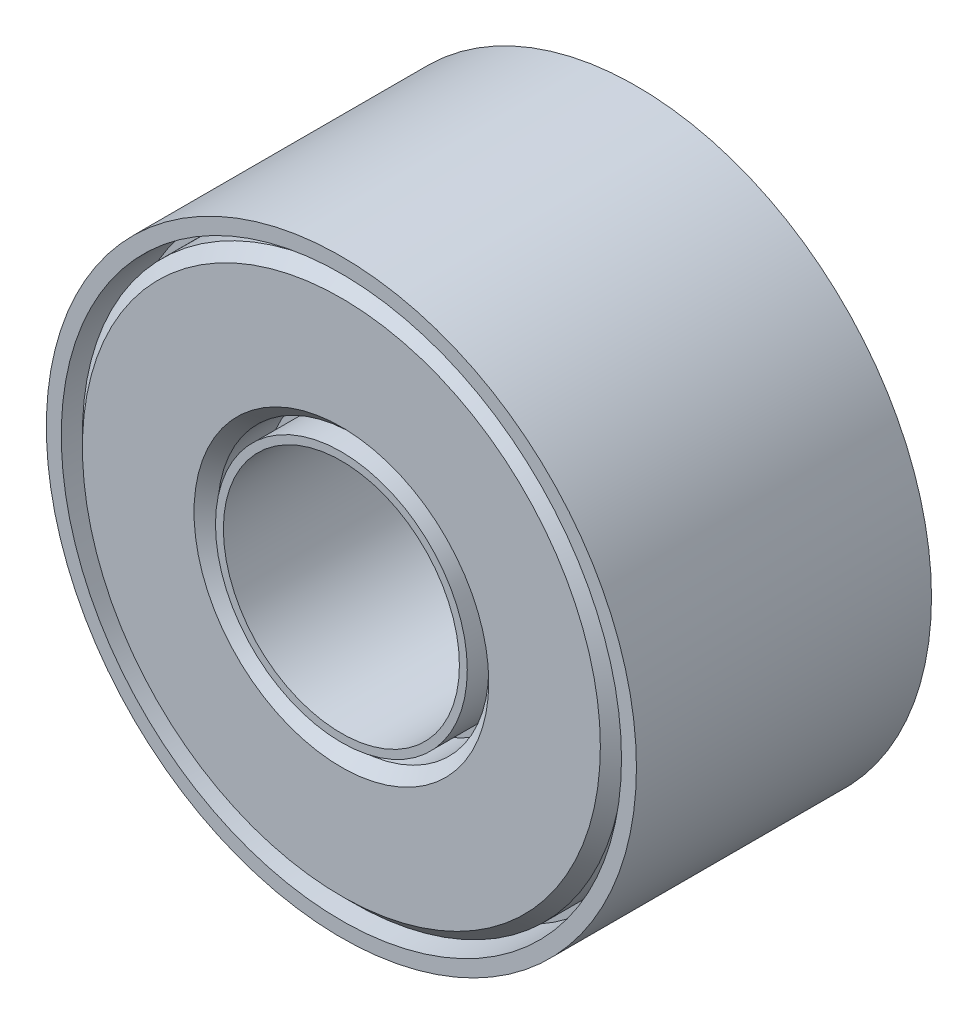
ISO-10303-21;
HEADER;
FILE_DESCRIPTION(('STEP AP214'),'2;1');
FILE_NAME('part.step','',(''),(''),'','','');
FILE_SCHEMA(('AUTOMOTIVE_DESIGN { 1 0 10303 214 1 1 1 1 }'));
ENDSEC;
DATA;
#1=APPLICATION_CONTEXT('core data for automotive mechanical design processes');
#2=APPLICATION_PROTOCOL_DEFINITION('international standard','automotive_design',2000,#1);
#3=PRODUCT_CONTEXT('',#1,'mechanical');
#4=PRODUCT('Part','Part','',(#3));
#5=PRODUCT_RELATED_PRODUCT_CATEGORY('part','',(#4));
#6=PRODUCT_DEFINITION_FORMATION('','',#4);
#7=PRODUCT_DEFINITION_CONTEXT('part definition',#1,'design');
#8=PRODUCT_DEFINITION('design','',#6,#7);
#9=PRODUCT_DEFINITION_SHAPE('','',#8);
#10=(LENGTH_UNIT() NAMED_UNIT(*) SI_UNIT(.MILLI.,.METRE.));
#11=(NAMED_UNIT(*) PLANE_ANGLE_UNIT() SI_UNIT($,.RADIAN.));
#12=(NAMED_UNIT(*) SI_UNIT($,.STERADIAN.) SOLID_ANGLE_UNIT());
#13=UNCERTAINTY_MEASURE_WITH_UNIT(LENGTH_MEASURE(1.E-05),#10,'distance_accuracy_value','');
#14=(GEOMETRIC_REPRESENTATION_CONTEXT(3) GLOBAL_UNCERTAINTY_ASSIGNED_CONTEXT((#13)) GLOBAL_UNIT_ASSIGNED_CONTEXT((#10,
#11,#12)) REPRESENTATION_CONTEXT('',''));
#15=CARTESIAN_POINT('',(0.,0.,0.));
#16=DIRECTION('',(0.,0.,1.));
#17=DIRECTION('',(1.,0.,0.));
#18=AXIS2_PLACEMENT_3D('',#15,#16,#17);
#19=CARTESIAN_POINT('',(0.,0.,0.));
#20=DIRECTION('',(0.,0.,1.));
#21=DIRECTION('',(1.,0.,0.));
#22=AXIS2_PLACEMENT_3D('',#19,#20,#21);
#23=PLANE('',#22);
#24=CARTESIAN_POINT('',(0.,0.,0.));
#25=DIRECTION('',(0.,0.,1.));
#26=DIRECTION('',(1.,0.,0.));
#27=AXIS2_PLACEMENT_3D('',#24,#25,#26);
#28=CIRCLE('',#27,1.);
#29=CARTESIAN_POINT('',(1.,0.,0.));
#30=VERTEX_POINT('',#29);
#31=EDGE_CURVE('E105',#30,#30,#28,.T.);
#32=ORIENTED_EDGE('',*,*,#31,.T.);
#33=EDGE_LOOP('',(#32));
#34=FACE_BOUND('',#33,.T.);
#35=CARTESIAN_POINT('',(0.,0.,0.));
#36=DIRECTION('',(0.,0.,1.));
#37=DIRECTION('',(1.,0.,0.));
#38=AXIS2_PLACEMENT_3D('',#35,#36,#37);
#39=CIRCLE('',#38,1.06669738194311);
#40=CARTESIAN_POINT('',(1.06669738194311,0.,0.));
#41=VERTEX_POINT('',#40);
#42=EDGE_CURVE('E137',#41,#41,#39,.T.);
#43=ORIENTED_EDGE('',*,*,#42,.F.);
#44=EDGE_LOOP('',(#43));
#45=FACE_BOUND('',#44,.T.);
#46=ADVANCED_FACE('F55',(#34,#45),#23,.F.);
#47=CARTESIAN_POINT('',(0.,0.,2.5));
#48=DIRECTION('',(0.,0.,1.));
#49=DIRECTION('',(1.,0.,0.));
#50=AXIS2_PLACEMENT_3D('',#47,#48,#49);
#51=PLANE('',#50);
#52=CARTESIAN_POINT('',(0.,0.,2.5));
#53=DIRECTION('',(0.,0.,1.));
#54=DIRECTION('',(1.,0.,0.));
#55=AXIS2_PLACEMENT_3D('',#52,#53,#54);
#56=CIRCLE('',#55,1.);
#57=CARTESIAN_POINT('',(1.,0.,2.5));
#58=VERTEX_POINT('',#57);
#59=EDGE_CURVE('E101',#58,#58,#56,.T.);
#60=ORIENTED_EDGE('',*,*,#59,.F.);
#61=EDGE_LOOP('',(#60));
#62=FACE_BOUND('',#61,.T.);
#63=CARTESIAN_POINT('',(0.,0.,2.5));
#64=DIRECTION('',(0.,0.,1.));
#65=DIRECTION('',(1.,0.,0.));
#66=AXIS2_PLACEMENT_3D('',#63,#64,#65);
#67=CIRCLE('',#66,1.06669738194311);
#68=CARTESIAN_POINT('',(1.06669738194311,0.,2.5));
#69=VERTEX_POINT('',#68);
#70=EDGE_CURVE('E113',#69,#69,#67,.T.);
#71=ORIENTED_EDGE('',*,*,#70,.T.);
#72=EDGE_LOOP('',(#71));
#73=FACE_BOUND('',#72,.T.);
#74=ADVANCED_FACE('F179',(#62,#73),#51,.T.);
#75=CARTESIAN_POINT('',(0.,0.,2.5));
#76=DIRECTION('',(0.,0.,1.));
#77=DIRECTION('',(1.,0.,0.));
#78=AXIS2_PLACEMENT_3D('',#75,#76,#77);
#79=CIRCLE('',#78,2.37345333101768);
#80=CARTESIAN_POINT('',(2.37345333101768,0.,2.5));
#81=VERTEX_POINT('',#80);
#82=EDGE_CURVE('E125',#81,#81,#79,.T.);
#83=ORIENTED_EDGE('',*,*,#82,.F.);
#84=EDGE_LOOP('',(#83));
#85=FACE_BOUND('',#84,.T.);
#86=CARTESIAN_POINT('',(0.,0.,2.5));
#87=DIRECTION('',(0.,0.,1.));
#88=DIRECTION('',(1.,0.,0.));
#89=AXIS2_PLACEMENT_3D('',#86,#87,#88);
#90=CIRCLE('',#89,2.5);
#91=CARTESIAN_POINT('',(2.5,0.,2.5));
#92=VERTEX_POINT('',#91);
#93=EDGE_CURVE('E96',#92,#92,#90,.T.);
#94=ORIENTED_EDGE('',*,*,#93,.T.);
#95=EDGE_LOOP('',(#94));
#96=FACE_BOUND('',#95,.T.);
#97=ADVANCED_FACE('F187',(#85,#96),#51,.T.);
#98=CARTESIAN_POINT('',(0.,0.,0.));
#99=DIRECTION('',(0.,0.,1.));
#100=DIRECTION('',(1.,0.,0.));
#101=AXIS2_PLACEMENT_3D('',#98,#99,#100);
#102=CIRCLE('',#101,2.37345333101768);
#103=CARTESIAN_POINT('',(2.37345333101768,0.,0.));
#104=VERTEX_POINT('',#103);
#105=EDGE_CURVE('E149',#104,#104,#102,.T.);
#106=ORIENTED_EDGE('',*,*,#105,.T.);
#107=EDGE_LOOP('',(#106));
#108=FACE_BOUND('',#107,.T.);
#109=CARTESIAN_POINT('',(0.,0.,0.));
#110=DIRECTION('',(0.,0.,1.));
#111=DIRECTION('',(1.,0.,0.));
#112=AXIS2_PLACEMENT_3D('',#109,#110,#111);
#113=CIRCLE('',#112,2.5);
#114=CARTESIAN_POINT('',(2.5,0.,0.));
#115=VERTEX_POINT('',#114);
#116=EDGE_CURVE('E97',#115,#115,#113,.T.);
#117=ORIENTED_EDGE('',*,*,#116,.F.);
#118=EDGE_LOOP('',(#117));
#119=FACE_BOUND('',#118,.T.);
#120=ADVANCED_FACE('F182',(#108,#119),#23,.F.);
#121=CARTESIAN_POINT('',(0.,0.,2.5));
#122=DIRECTION('',(0.,0.,-1.));
#123=DIRECTION('',(-1.,0.,0.));
#124=AXIS2_PLACEMENT_3D('',#121,#122,#123);
#125=CYLINDRICAL_SURFACE('',#124,2.5);
#126=ORIENTED_EDGE('',*,*,#93,.F.);
#127=EDGE_LOOP('',(#126));
#128=FACE_BOUND('',#127,.T.);
#129=ORIENTED_EDGE('',*,*,#116,.T.);
#130=EDGE_LOOP('',(#129));
#131=FACE_BOUND('',#130,.T.);
#132=ADVANCED_FACE('F194',(#128,#131),#125,.T.);
#133=CARTESIAN_POINT('',(0.,0.,2.5));
#134=DIRECTION('',(0.,0.,-1.));
#135=DIRECTION('',(-1.,0.,0.));
#136=AXIS2_PLACEMENT_3D('',#133,#134,#135);
#137=CYLINDRICAL_SURFACE('',#136,1.);
#138=ORIENTED_EDGE('',*,*,#59,.T.);
#139=EDGE_LOOP('',(#138));
#140=FACE_BOUND('',#139,.T.);
#141=ORIENTED_EDGE('',*,*,#31,.F.);
#142=EDGE_LOOP('',(#141));
#143=FACE_BOUND('',#142,.T.);
#144=ADVANCED_FACE('F366',(#140,#143),#137,.F.);
#145=CARTESIAN_POINT('',(0.,0.,2.));
#146=DIRECTION('',(0.,0.,1.));
#147=DIRECTION('',(1.,0.,0.));
#148=AXIS2_PLACEMENT_3D('',#145,#146,#147);
#149=CYLINDRICAL_SURFACE('',#148,1.06669738194311);
#150=CARTESIAN_POINT('',(0.,0.,2.));
#151=DIRECTION('',(0.,0.,1.));
#152=DIRECTION('',(1.,0.,0.));
#153=AXIS2_PLACEMENT_3D('',#150,#151,#152);
#154=CIRCLE('',#153,1.06669738194311);
#155=CARTESIAN_POINT('',(1.06669738194311,0.,2.));
#156=VERTEX_POINT('',#155);
#157=EDGE_CURVE('E117',#156,#156,#154,.T.);
#158=ORIENTED_EDGE('',*,*,#157,.T.);
#159=EDGE_LOOP('',(#158));
#160=FACE_BOUND('',#159,.T.);
#161=ORIENTED_EDGE('',*,*,#70,.F.);
#162=EDGE_LOOP('',(#161));
#163=FACE_BOUND('',#162,.T.);
#164=ADVANCED_FACE('F336',(#160,#163),#149,.T.);
#165=CARTESIAN_POINT('',(0.,0.,2.));
#166=DIRECTION('',(0.,0.,1.));
#167=DIRECTION('',(1.,0.,0.));
#168=AXIS2_PLACEMENT_3D('',#165,#166,#167);
#169=CYLINDRICAL_SURFACE('',#168,1.14863392921502);
#170=CARTESIAN_POINT('',(0.,0.,2.4));
#171=DIRECTION('',(0.,0.,1.));
#172=DIRECTION('',(1.,0.,0.));
#173=AXIS2_PLACEMENT_3D('',#170,#171,#172);
#174=CIRCLE('',#173,1.14863392921502);
#175=CARTESIAN_POINT('',(1.14863392921502,0.,2.4));
#176=VERTEX_POINT('',#175);
#177=EDGE_CURVE('E80',#176,#176,#174,.T.);
#178=ORIENTED_EDGE('',*,*,#177,.T.);
#179=EDGE_LOOP('',(#178));
#180=FACE_BOUND('',#179,.T.);
#181=CARTESIAN_POINT('',(0.,0.,2.));
#182=DIRECTION('',(0.,0.,1.));
#183=DIRECTION('',(1.,0.,0.));
#184=AXIS2_PLACEMENT_3D('',#181,#182,#183);
#185=CIRCLE('',#184,1.14863392921502);
#186=CARTESIAN_POINT('',(1.14863392921502,0.,2.));
#187=VERTEX_POINT('',#186);
#188=EDGE_CURVE('E109',#187,#187,#185,.T.);
#189=ORIENTED_EDGE('',*,*,#188,.F.);
#190=EDGE_LOOP('',(#189));
#191=FACE_BOUND('',#190,.T.);
#192=ADVANCED_FACE('F331',(#180,#191),#169,.F.);
#193=CARTESIAN_POINT('',(0.,0.,2.));
#194=DIRECTION('',(0.,0.,1.));
#195=DIRECTION('',(1.,0.,0.));
#196=AXIS2_PLACEMENT_3D('',#193,#194,#195);
#197=PLANE('',#196);
#198=ORIENTED_EDGE('',*,*,#157,.F.);
#199=EDGE_LOOP('',(#198));
#200=FACE_BOUND('',#199,.T.);
#201=ORIENTED_EDGE('',*,*,#188,.T.);
#202=EDGE_LOOP('',(#201));
#203=FACE_BOUND('',#202,.T.);
#204=ADVANCED_FACE('F321',(#200,#203),#197,.T.);
#205=CARTESIAN_POINT('',(0.,0.,2.));
#206=DIRECTION('',(0.,0.,1.));
#207=DIRECTION('',(1.,0.,0.));
#208=AXIS2_PLACEMENT_3D('',#205,#206,#207);
#209=CYLINDRICAL_SURFACE('',#208,2.29427452184268);
#210=CARTESIAN_POINT('',(0.,0.,2.4));
#211=DIRECTION('',(0.,0.,1.));
#212=DIRECTION('',(1.,0.,0.));
#213=AXIS2_PLACEMENT_3D('',#210,#211,#212);
#214=CIRCLE('',#213,2.29427452184268);
#215=CARTESIAN_POINT('',(2.29427452184268,0.,2.4));
#216=VERTEX_POINT('',#215);
#217=EDGE_CURVE('E84',#216,#216,#214,.F.);
#218=ORIENTED_EDGE('',*,*,#217,.T.);
#219=EDGE_LOOP('',(#218));
#220=FACE_BOUND('',#219,.T.);
#221=CARTESIAN_POINT('',(0.,0.,2.));
#222=DIRECTION('',(0.,0.,1.));
#223=DIRECTION('',(1.,0.,0.));
#224=AXIS2_PLACEMENT_3D('',#221,#222,#223);
#225=CIRCLE('',#224,2.29427452184268);
#226=CARTESIAN_POINT('',(2.29427452184268,0.,2.));
#227=VERTEX_POINT('',#226);
#228=EDGE_CURVE('E129',#227,#227,#225,.T.);
#229=ORIENTED_EDGE('',*,*,#228,.T.);
#230=EDGE_LOOP('',(#229));
#231=FACE_BOUND('',#230,.T.);
#232=ADVANCED_FACE('F315',(#220,#231),#209,.T.);
#233=CARTESIAN_POINT('',(0.,0.,2.));
#234=DIRECTION('',(0.,0.,1.));
#235=DIRECTION('',(1.,0.,0.));
#236=AXIS2_PLACEMENT_3D('',#233,#234,#235);
#237=CYLINDRICAL_SURFACE('',#236,2.37345333101768);
#238=CARTESIAN_POINT('',(0.,0.,2.));
#239=DIRECTION('',(0.,0.,1.));
#240=DIRECTION('',(1.,0.,0.));
#241=AXIS2_PLACEMENT_3D('',#238,#239,#240);
#242=CIRCLE('',#241,2.37345333101768);
#243=CARTESIAN_POINT('',(2.37345333101768,0.,2.));
#244=VERTEX_POINT('',#243);
#245=EDGE_CURVE('E118',#244,#244,#242,.T.);
#246=ORIENTED_EDGE('',*,*,#245,.F.);
#247=EDGE_LOOP('',(#246));
#248=FACE_BOUND('',#247,.T.);
#249=ORIENTED_EDGE('',*,*,#82,.T.);
#250=EDGE_LOOP('',(#249));
#251=FACE_BOUND('',#250,.T.);
#252=ADVANCED_FACE('F320',(#248,#251),#237,.F.);
#253=CARTESIAN_POINT('',(0.,0.,2.));
#254=DIRECTION('',(0.,0.,1.));
#255=DIRECTION('',(1.,0.,0.));
#256=AXIS2_PLACEMENT_3D('',#253,#254,#255);
#257=PLANE('',#256);
#258=ORIENTED_EDGE('',*,*,#228,.F.);
#259=EDGE_LOOP('',(#258));
#260=FACE_BOUND('',#259,.T.);
#261=ORIENTED_EDGE('',*,*,#245,.T.);
#262=EDGE_LOOP('',(#261));
#263=FACE_BOUND('',#262,.T.);
#264=ADVANCED_FACE('F307',(#260,#263),#257,.T.);
#265=CARTESIAN_POINT('',(0.,0.,2.5));
#266=DIRECTION('',(0.,0.,1.));
#267=DIRECTION('',(1.,0.,0.));
#268=AXIS2_PLACEMENT_3D('',#265,#266,#267);
#269=CIRCLE('',#268,2.19427452184268);
#270=CARTESIAN_POINT('',(2.19427452184268,0.,2.5));
#271=VERTEX_POINT('',#270);
#272=EDGE_CURVE('E88',#271,#271,#269,.T.);
#273=ORIENTED_EDGE('',*,*,#272,.T.);
#274=EDGE_LOOP('',(#273));
#275=FACE_BOUND('',#274,.T.);
#276=CARTESIAN_POINT('',(0.,0.,2.5));
#277=DIRECTION('',(0.,0.,1.));
#278=DIRECTION('',(1.,0.,0.));
#279=AXIS2_PLACEMENT_3D('',#276,#277,#278);
#280=CIRCLE('',#279,1.24863392921501);
#281=CARTESIAN_POINT('',(1.24863392921501,0.,2.5));
#282=VERTEX_POINT('',#281);
#283=EDGE_CURVE('E92',#282,#282,#280,.F.);
#284=ORIENTED_EDGE('',*,*,#283,.T.);
#285=EDGE_LOOP('',(#284));
#286=FACE_BOUND('',#285,.T.);
#287=ADVANCED_FACE('F190',(#275,#286),#51,.T.);
#288=CARTESIAN_POINT('',(0.,0.,2.5));
#289=DIRECTION('',(0.,0.,-1.));
#290=DIRECTION('',(-1.,0.,0.));
#291=AXIS2_PLACEMENT_3D('',#288,#289,#290);
#292=CONICAL_SURFACE('',#291,2.19427452184268,0.785398163397448);
#293=ORIENTED_EDGE('',*,*,#217,.F.);
#294=EDGE_LOOP('',(#293));
#295=FACE_BOUND('',#294,.T.);
#296=ORIENTED_EDGE('',*,*,#272,.F.);
#297=EDGE_LOOP('',(#296));
#298=FACE_BOUND('',#297,.T.);
#299=ADVANCED_FACE('F287',(#295,#298),#292,.T.);
#300=CARTESIAN_POINT('',(0.,0.,2.4));
#301=DIRECTION('',(0.,0.,1.));
#302=DIRECTION('',(1.,0.,0.));
#303=AXIS2_PLACEMENT_3D('',#300,#301,#302);
#304=CONICAL_SURFACE('',#303,1.14863392921502,0.785398163397454);
#305=ORIENTED_EDGE('',*,*,#283,.F.);
#306=EDGE_LOOP('',(#305));
#307=FACE_BOUND('',#306,.T.);
#308=ORIENTED_EDGE('',*,*,#177,.F.);
#309=EDGE_LOOP('',(#308));
#310=FACE_BOUND('',#309,.T.);
#311=ADVANCED_FACE('F262',(#307,#310),#304,.F.);
#312=CARTESIAN_POINT('',(0.,0.,0.5));
#313=DIRECTION('',(0.,0.,-1.));
#314=DIRECTION('',(-1.,0.,0.));
#315=AXIS2_PLACEMENT_3D('',#312,#313,#314);
#316=CYLINDRICAL_SURFACE('',#315,1.06669738194311);
#317=CARTESIAN_POINT('',(0.,0.,0.5));
#318=DIRECTION('',(0.,0.,1.));
#319=DIRECTION('',(1.,0.,0.));
#320=AXIS2_PLACEMENT_3D('',#317,#318,#319);
#321=CIRCLE('',#320,1.06669738194311);
#322=CARTESIAN_POINT('',(1.06669738194311,0.,0.5));
#323=VERTEX_POINT('',#322);
#324=EDGE_CURVE('E141',#323,#323,#321,.T.);
#325=ORIENTED_EDGE('',*,*,#324,.F.);
#326=EDGE_LOOP('',(#325));
#327=FACE_BOUND('',#326,.T.);
#328=ORIENTED_EDGE('',*,*,#42,.T.);
#329=EDGE_LOOP('',(#328));
#330=FACE_BOUND('',#329,.T.);
#331=ADVANCED_FACE('F239',(#327,#330),#316,.T.);
#332=CARTESIAN_POINT('',(0.,0.,0.5));
#333=DIRECTION('',(0.,0.,-1.));
#334=DIRECTION('',(-1.,0.,0.));
#335=AXIS2_PLACEMENT_3D('',#332,#333,#334);
#336=CYLINDRICAL_SURFACE('',#335,1.14863392921502);
#337=CARTESIAN_POINT('',(0.,0.,0.100000000000001));
#338=DIRECTION('',(0.,0.,1.));
#339=DIRECTION('',(1.,0.,0.));
#340=AXIS2_PLACEMENT_3D('',#337,#338,#339);
#341=CIRCLE('',#340,1.14863392921502);
#342=CARTESIAN_POINT('',(1.14863392921502,0.,0.100000000000001));
#343=VERTEX_POINT('',#342);
#344=EDGE_CURVE('E64',#343,#343,#341,.F.);
#345=ORIENTED_EDGE('',*,*,#344,.T.);
#346=EDGE_LOOP('',(#345));
#347=FACE_BOUND('',#346,.T.);
#348=CARTESIAN_POINT('',(0.,0.,0.5));
#349=DIRECTION('',(0.,0.,1.));
#350=DIRECTION('',(1.,0.,0.));
#351=AXIS2_PLACEMENT_3D('',#348,#349,#350);
#352=CIRCLE('',#351,1.14863392921502);
#353=CARTESIAN_POINT('',(1.14863392921502,0.,0.5));
#354=VERTEX_POINT('',#353);
#355=EDGE_CURVE('E130',#354,#354,#352,.T.);
#356=ORIENTED_EDGE('',*,*,#355,.T.);
#357=EDGE_LOOP('',(#356));
#358=FACE_BOUND('',#357,.T.);
#359=ADVANCED_FACE('F175',(#347,#358),#336,.F.);
#360=CARTESIAN_POINT('',(0.,0.,0.5));
#361=DIRECTION('',(0.,0.,-1.));
#362=DIRECTION('',(1.,0.,0.));
#363=AXIS2_PLACEMENT_3D('',#360,#361,#362);
#364=PLANE('',#363);
#365=ORIENTED_EDGE('',*,*,#324,.T.);
#366=EDGE_LOOP('',(#365));
#367=FACE_BOUND('',#366,.T.);
#368=ORIENTED_EDGE('',*,*,#355,.F.);
#369=EDGE_LOOP('',(#368));
#370=FACE_BOUND('',#369,.T.);
#371=ADVANCED_FACE('F167',(#367,#370),#364,.T.);
#372=CARTESIAN_POINT('',(0.,0.,0.5));
#373=DIRECTION('',(0.,0.,-1.));
#374=DIRECTION('',(-1.,0.,0.));
#375=AXIS2_PLACEMENT_3D('',#372,#373,#374);
#376=CYLINDRICAL_SURFACE('',#375,2.29427452184268);
#377=CARTESIAN_POINT('',(0.,0.,0.0999999999999994));
#378=DIRECTION('',(0.,0.,1.));
#379=DIRECTION('',(1.,0.,0.));
#380=AXIS2_PLACEMENT_3D('',#377,#378,#379);
#381=CIRCLE('',#380,2.29427452184268);
#382=CARTESIAN_POINT('',(2.29427452184268,0.,0.0999999999999994));
#383=VERTEX_POINT('',#382);
#384=EDGE_CURVE('E11',#383,#383,#381,.T.);
#385=ORIENTED_EDGE('',*,*,#384,.T.);
#386=EDGE_LOOP('',(#385));
#387=FACE_BOUND('',#386,.T.);
#388=CARTESIAN_POINT('',(0.,0.,0.5));
#389=DIRECTION('',(0.,0.,1.));
#390=DIRECTION('',(1.,0.,0.));
#391=AXIS2_PLACEMENT_3D('',#388,#389,#390);
#392=CIRCLE('',#391,2.29427452184268);
#393=CARTESIAN_POINT('',(2.29427452184268,0.,0.5));
#394=VERTEX_POINT('',#393);
#395=EDGE_CURVE('E153',#394,#394,#392,.T.);
#396=ORIENTED_EDGE('',*,*,#395,.F.);
#397=EDGE_LOOP('',(#396));
#398=FACE_BOUND('',#397,.T.);
#399=ADVANCED_FACE('F164',(#387,#398),#376,.T.);
#400=CARTESIAN_POINT('',(0.,0.,0.5));
#401=DIRECTION('',(0.,0.,-1.));
#402=DIRECTION('',(-1.,0.,0.));
#403=AXIS2_PLACEMENT_3D('',#400,#401,#402);
#404=CYLINDRICAL_SURFACE('',#403,2.37345333101768);
#405=CARTESIAN_POINT('',(0.,0.,0.5));
#406=DIRECTION('',(0.,0.,1.));
#407=DIRECTION('',(1.,0.,0.));
#408=AXIS2_PLACEMENT_3D('',#405,#406,#407);
#409=CIRCLE('',#408,2.37345333101768);
#410=CARTESIAN_POINT('',(2.37345333101768,0.,0.5));
#411=VERTEX_POINT('',#410);
#412=EDGE_CURVE('E142',#411,#411,#409,.T.);
#413=ORIENTED_EDGE('',*,*,#412,.T.);
#414=EDGE_LOOP('',(#413));
#415=FACE_BOUND('',#414,.T.);
#416=ORIENTED_EDGE('',*,*,#105,.F.);
#417=EDGE_LOOP('',(#416));
#418=FACE_BOUND('',#417,.T.);
#419=ADVANCED_FACE('F166',(#415,#418),#404,.F.);
#420=CARTESIAN_POINT('',(0.,0.,0.5));
#421=DIRECTION('',(0.,0.,-1.));
#422=DIRECTION('',(1.,0.,0.));
#423=AXIS2_PLACEMENT_3D('',#420,#421,#422);
#424=PLANE('',#423);
#425=ORIENTED_EDGE('',*,*,#395,.T.);
#426=EDGE_LOOP('',(#425));
#427=FACE_BOUND('',#426,.T.);
#428=ORIENTED_EDGE('',*,*,#412,.F.);
#429=EDGE_LOOP('',(#428));
#430=FACE_BOUND('',#429,.T.);
#431=ADVANCED_FACE('F161',(#427,#430),#424,.T.);
#432=CARTESIAN_POINT('',(0.,0.,0.));
#433=DIRECTION('',(0.,0.,1.));
#434=DIRECTION('',(1.,0.,0.));
#435=AXIS2_PLACEMENT_3D('',#432,#433,#434);
#436=CIRCLE('',#435,1.24863392921502);
#437=CARTESIAN_POINT('',(1.24863392921502,0.,0.));
#438=VERTEX_POINT('',#437);
#439=EDGE_CURVE('E69',#438,#438,#436,.T.);
#440=ORIENTED_EDGE('',*,*,#439,.T.);
#441=EDGE_LOOP('',(#440));
#442=FACE_BOUND('',#441,.T.);
#443=CARTESIAN_POINT('',(0.,0.,0.));
#444=DIRECTION('',(0.,0.,1.));
#445=DIRECTION('',(1.,0.,0.));
#446=AXIS2_PLACEMENT_3D('',#443,#444,#445);
#447=CIRCLE('',#446,2.19427452184268);
#448=CARTESIAN_POINT('',(2.19427452184268,0.,0.));
#449=VERTEX_POINT('',#448);
#450=EDGE_CURVE('E74',#449,#449,#447,.F.);
#451=ORIENTED_EDGE('',*,*,#450,.T.);
#452=EDGE_LOOP('',(#451));
#453=FACE_BOUND('',#452,.T.);
#454=ADVANCED_FACE('F183',(#442,#453),#23,.F.);
#455=CARTESIAN_POINT('',(0.,0.,0.));
#456=DIRECTION('',(0.,0.,-1.));
#457=DIRECTION('',(-1.,0.,0.));
#458=AXIS2_PLACEMENT_3D('',#455,#456,#457);
#459=CONICAL_SURFACE('',#458,1.24863392921502,0.785398163397445);
#460=ORIENTED_EDGE('',*,*,#344,.F.);
#461=EDGE_LOOP('',(#460));
#462=FACE_BOUND('',#461,.T.);
#463=ORIENTED_EDGE('',*,*,#439,.F.);
#464=EDGE_LOOP('',(#463));
#465=FACE_BOUND('',#464,.T.);
#466=ADVANCED_FACE('F197',(#462,#465),#459,.F.);
#467=CARTESIAN_POINT('',(0.,0.,0.0999999999999994));
#468=DIRECTION('',(0.,0.,1.));
#469=DIRECTION('',(1.,0.,0.));
#470=AXIS2_PLACEMENT_3D('',#467,#468,#469);
#471=CONICAL_SURFACE('',#470,2.29427452184268,0.78539816339745);
#472=ORIENTED_EDGE('',*,*,#450,.F.);
#473=EDGE_LOOP('',(#472));
#474=FACE_BOUND('',#473,.T.);
#475=ORIENTED_EDGE('',*,*,#384,.F.);
#476=EDGE_LOOP('',(#475));
#477=FACE_BOUND('',#476,.T.);
#478=ADVANCED_FACE('F58',(#474,#477),#471,.T.);
#479=CLOSED_SHELL('',(#46,#74,#97,#120,#132,#144,#164,#192,#204,#232,#252,#264,#287,#299,#311,
#331,#359,#371,#399,#419,#431,#454,#466,#478));
#480=MANIFOLD_SOLID_BREP('B2',#479);
#481=ADVANCED_BREP_SHAPE_REPRESENTATION('',(#18,#480),#14);
#482=SHAPE_DEFINITION_REPRESENTATION(#9,#481);
ENDSEC;
END-ISO-10303-21;
